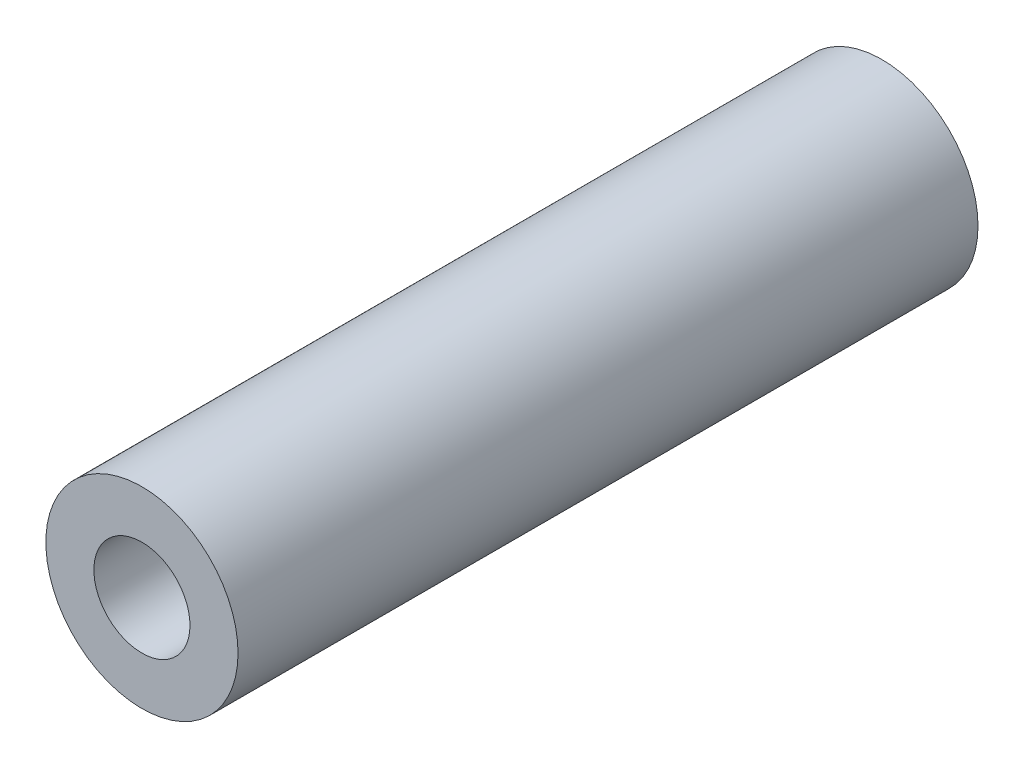
ISO-10303-21;
HEADER;
FILE_DESCRIPTION(('STEP AP214'),'2;1');
FILE_NAME('part.step','',(''),(''),'','','');
FILE_SCHEMA(('AUTOMOTIVE_DESIGN { 1 0 10303 214 1 1 1 1 }'));
ENDSEC;
DATA;
#1=APPLICATION_CONTEXT('core data for automotive mechanical design processes');
#2=APPLICATION_PROTOCOL_DEFINITION('international standard','automotive_design',2000,#1);
#3=PRODUCT_CONTEXT('',#1,'mechanical');
#4=PRODUCT('Part','Part','',(#3));
#5=PRODUCT_RELATED_PRODUCT_CATEGORY('part','',(#4));
#6=PRODUCT_DEFINITION_FORMATION('','',#4);
#7=PRODUCT_DEFINITION_CONTEXT('part definition',#1,'design');
#8=PRODUCT_DEFINITION('design','',#6,#7);
#9=PRODUCT_DEFINITION_SHAPE('','',#8);
#10=(LENGTH_UNIT() NAMED_UNIT(*) SI_UNIT(.MILLI.,.METRE.));
#11=(NAMED_UNIT(*) PLANE_ANGLE_UNIT() SI_UNIT($,.RADIAN.));
#12=(NAMED_UNIT(*) SI_UNIT($,.STERADIAN.) SOLID_ANGLE_UNIT());
#13=UNCERTAINTY_MEASURE_WITH_UNIT(LENGTH_MEASURE(1.E-05),#10,'distance_accuracy_value','');
#14=(GEOMETRIC_REPRESENTATION_CONTEXT(3) GLOBAL_UNCERTAINTY_ASSIGNED_CONTEXT((#13)) GLOBAL_UNIT_ASSIGNED_CONTEXT((#10,
#11,#12)) REPRESENTATION_CONTEXT('',''));
#15=CARTESIAN_POINT('',(0.,0.,0.));
#16=DIRECTION('',(0.,0.,1.));
#17=DIRECTION('',(1.,0.,0.));
#18=AXIS2_PLACEMENT_3D('',#15,#16,#17);
#19=CARTESIAN_POINT('',(0.,0.,23.1));
#20=DIRECTION('',(0.,0.,-1.));
#21=DIRECTION('',(-1.,0.,0.));
#22=AXIS2_PLACEMENT_3D('',#19,#20,#21);
#23=CYLINDRICAL_SURFACE('',#22,3.);
#24=CARTESIAN_POINT('',(0.,0.,23.1));
#25=DIRECTION('',(0.,0.,1.));
#26=DIRECTION('',(1.,0.,0.));
#27=AXIS2_PLACEMENT_3D('',#24,#25,#26);
#28=CIRCLE('',#27,3.);
#29=CARTESIAN_POINT('',(3.,0.,23.1));
#30=VERTEX_POINT('',#29);
#31=EDGE_CURVE('E10',#30,#30,#28,.T.);
#32=ORIENTED_EDGE('',*,*,#31,.F.);
#33=EDGE_LOOP('',(#32));
#34=FACE_BOUND('',#33,.T.);
#35=CARTESIAN_POINT('',(0.,0.,0.));
#36=DIRECTION('',(0.,0.,1.));
#37=DIRECTION('',(1.,0.,0.));
#38=AXIS2_PLACEMENT_3D('',#35,#36,#37);
#39=CIRCLE('',#38,3.);
#40=CARTESIAN_POINT('',(3.,0.,0.));
#41=VERTEX_POINT('',#40);
#42=EDGE_CURVE('E40',#41,#41,#39,.T.);
#43=ORIENTED_EDGE('',*,*,#42,.T.);
#44=EDGE_LOOP('',(#43));
#45=FACE_BOUND('',#44,.T.);
#46=ADVANCED_FACE('F37',(#34,#45),#23,.T.);
#47=CARTESIAN_POINT('',(0.,0.,23.1));
#48=DIRECTION('',(0.,0.,1.));
#49=DIRECTION('',(1.,0.,0.));
#50=AXIS2_PLACEMENT_3D('',#47,#48,#49);
#51=PLANE('',#50);
#52=CARTESIAN_POINT('',(0.,0.,23.1));
#53=DIRECTION('',(0.,0.,1.));
#54=DIRECTION('',(1.,0.,0.));
#55=AXIS2_PLACEMENT_3D('',#52,#53,#54);
#56=CIRCLE('',#55,1.5);
#57=CARTESIAN_POINT('',(1.5,0.,23.1));
#58=VERTEX_POINT('',#57);
#59=EDGE_CURVE('E51',#58,#58,#56,.T.);
#60=ORIENTED_EDGE('',*,*,#59,.F.);
#61=EDGE_LOOP('',(#60));
#62=FACE_BOUND('',#61,.T.);
#63=ORIENTED_EDGE('',*,*,#31,.T.);
#64=EDGE_LOOP('',(#63));
#65=FACE_BOUND('',#64,.T.);
#66=ADVANCED_FACE('F68',(#62,#65),#51,.T.);
#67=CARTESIAN_POINT('',(0.,0.,0.));
#68=DIRECTION('',(0.,0.,1.));
#69=DIRECTION('',(1.,0.,0.));
#70=AXIS2_PLACEMENT_3D('',#67,#68,#69);
#71=PLANE('',#70);
#72=CARTESIAN_POINT('',(0.,0.,0.));
#73=DIRECTION('',(0.,0.,1.));
#74=DIRECTION('',(1.,0.,0.));
#75=AXIS2_PLACEMENT_3D('',#72,#73,#74);
#76=CIRCLE('',#75,1.5);
#77=CARTESIAN_POINT('',(1.5,0.,0.));
#78=VERTEX_POINT('',#77);
#79=EDGE_CURVE('E49',#78,#78,#76,.T.);
#80=ORIENTED_EDGE('',*,*,#79,.T.);
#81=EDGE_LOOP('',(#80));
#82=FACE_BOUND('',#81,.T.);
#83=ORIENTED_EDGE('',*,*,#42,.F.);
#84=EDGE_LOOP('',(#83));
#85=FACE_BOUND('',#84,.T.);
#86=ADVANCED_FACE('F59',(#82,#85),#71,.F.);
#87=CARTESIAN_POINT('',(0.,0.,0.));
#88=DIRECTION('',(0.,0.,1.));
#89=DIRECTION('',(1.,0.,0.));
#90=AXIS2_PLACEMENT_3D('',#87,#88,#89);
#91=CYLINDRICAL_SURFACE('',#90,1.5);
#92=ORIENTED_EDGE('',*,*,#79,.F.);
#93=EDGE_LOOP('',(#92));
#94=FACE_BOUND('',#93,.T.);
#95=ORIENTED_EDGE('',*,*,#59,.T.);
#96=EDGE_LOOP('',(#95));
#97=FACE_BOUND('',#96,.T.);
#98=ADVANCED_FACE('F62',(#94,#97),#91,.F.);
#99=CLOSED_SHELL('',(#46,#66,#86,#98));
#100=MANIFOLD_SOLID_BREP('B2',#99);
#101=ADVANCED_BREP_SHAPE_REPRESENTATION('',(#18,#100),#14);
#102=SHAPE_DEFINITION_REPRESENTATION(#9,#101);
ENDSEC;
END-ISO-10303-21;
